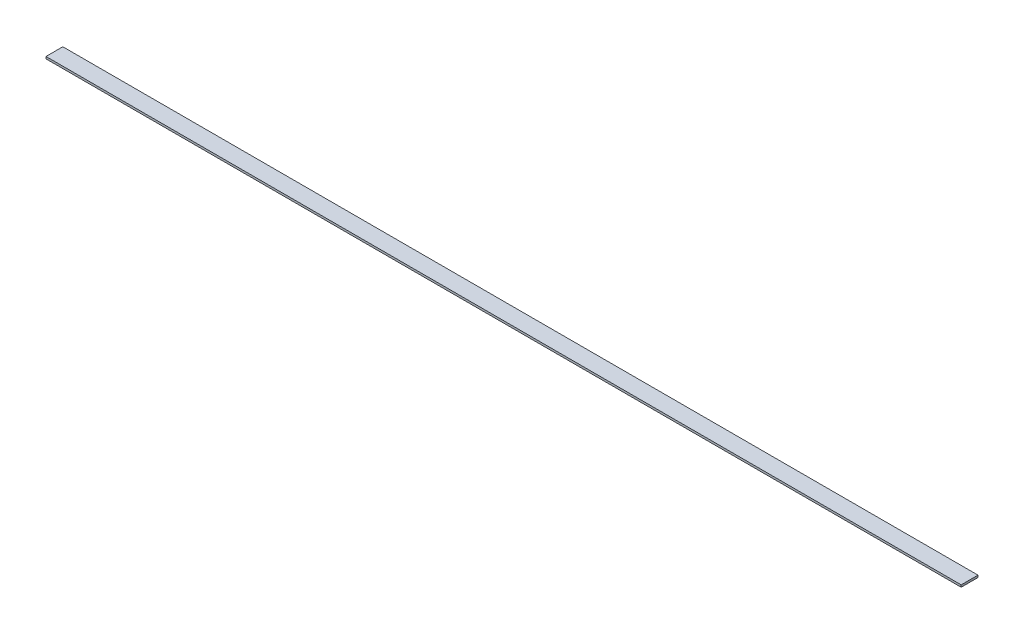
ISO-10303-21;
HEADER;
FILE_DESCRIPTION(('STEP AP214'),'2;1');
FILE_NAME('part.step','',(''),(''),'','','');
FILE_SCHEMA(('AUTOMOTIVE_DESIGN { 1 0 10303 214 1 1 1 1 }'));
ENDSEC;
DATA;
#1=APPLICATION_CONTEXT('core data for automotive mechanical design processes');
#2=APPLICATION_PROTOCOL_DEFINITION('international standard','automotive_design',2000,#1);
#3=PRODUCT_CONTEXT('',#1,'mechanical');
#4=PRODUCT('Part','Part','',(#3));
#5=PRODUCT_RELATED_PRODUCT_CATEGORY('part','',(#4));
#6=PRODUCT_DEFINITION_FORMATION('','',#4);
#7=PRODUCT_DEFINITION_CONTEXT('part definition',#1,'design');
#8=PRODUCT_DEFINITION('design','',#6,#7);
#9=PRODUCT_DEFINITION_SHAPE('','',#8);
#10=(LENGTH_UNIT() NAMED_UNIT(*) SI_UNIT(.MILLI.,.METRE.));
#11=(NAMED_UNIT(*) PLANE_ANGLE_UNIT() SI_UNIT($,.RADIAN.));
#12=(NAMED_UNIT(*) SI_UNIT($,.STERADIAN.) SOLID_ANGLE_UNIT());
#13=UNCERTAINTY_MEASURE_WITH_UNIT(LENGTH_MEASURE(1.E-05),#10,'distance_accuracy_value','');
#14=(GEOMETRIC_REPRESENTATION_CONTEXT(3) GLOBAL_UNCERTAINTY_ASSIGNED_CONTEXT((#13)) GLOBAL_UNIT_ASSIGNED_CONTEXT((#10,
#11,#12)) REPRESENTATION_CONTEXT('',''));
#15=CARTESIAN_POINT('',(0.,0.,0.));
#16=DIRECTION('',(0.,0.,1.));
#17=DIRECTION('',(1.,0.,0.));
#18=AXIS2_PLACEMENT_3D('',#15,#16,#17);
#19=CARTESIAN_POINT('',(544.,2.5,-10.));
#20=DIRECTION('',(-1.,0.,0.));
#21=DIRECTION('',(0.,0.,1.));
#22=AXIS2_PLACEMENT_3D('',#19,#20,#21);
#23=PLANE('',#22);
#24=DIRECTION('',(0.,0.,-1.));
#25=VECTOR('',#24,1.);
#26=CARTESIAN_POINT('',(544.,0.,-10.));
#27=LINE('',#26,#25);
#28=CARTESIAN_POINT('',(544.,0.,10.));
#29=VERTEX_POINT('',#28);
#30=CARTESIAN_POINT('',(544.,0.,-10.));
#31=VERTEX_POINT('',#30);
#32=EDGE_CURVE('E97',#29,#31,#27,.T.);
#33=ORIENTED_EDGE('',*,*,#32,.T.);
#34=DIRECTION('',(0.,-1.,0.));
#35=VECTOR('',#34,1.);
#36=CARTESIAN_POINT('',(544.,2.5,-10.));
#37=LINE('',#36,#35);
#38=CARTESIAN_POINT('',(544.,2.5,-10.));
#39=VERTEX_POINT('',#38);
#40=EDGE_CURVE('E11',#39,#31,#37,.T.);
#41=ORIENTED_EDGE('',*,*,#40,.F.);
#42=DIRECTION('',(0.,0.,-1.));
#43=VECTOR('',#42,1.);
#44=CARTESIAN_POINT('',(544.,2.5,-10.));
#45=LINE('',#44,#43);
#46=CARTESIAN_POINT('',(544.,2.5,10.));
#47=VERTEX_POINT('',#46);
#48=EDGE_CURVE('E85',#47,#39,#45,.T.);
#49=ORIENTED_EDGE('',*,*,#48,.F.);
#50=DIRECTION('',(0.,-1.,0.));
#51=VECTOR('',#50,1.);
#52=CARTESIAN_POINT('',(544.,2.5,10.));
#53=LINE('',#52,#51);
#54=EDGE_CURVE('E93',#47,#29,#53,.T.);
#55=ORIENTED_EDGE('',*,*,#54,.T.);
#56=EDGE_LOOP('',(#33,#41,#49,#55));
#57=FACE_BOUND('',#56,.T.);
#58=ADVANCED_FACE('F34',(#57),#23,.F.);
#59=CARTESIAN_POINT('',(-544.,2.5,-10.));
#60=DIRECTION('',(0.,0.,1.));
#61=DIRECTION('',(1.,0.,0.));
#62=AXIS2_PLACEMENT_3D('',#59,#60,#61);
#63=PLANE('',#62);
#64=DIRECTION('',(-1.,0.,0.));
#65=VECTOR('',#64,1.);
#66=CARTESIAN_POINT('',(-544.,0.,-10.));
#67=LINE('',#66,#65);
#68=CARTESIAN_POINT('',(-544.,0.,-10.));
#69=VERTEX_POINT('',#68);
#70=EDGE_CURVE('E89',#31,#69,#67,.T.);
#71=ORIENTED_EDGE('',*,*,#70,.T.);
#72=DIRECTION('',(0.,-1.,0.));
#73=VECTOR('',#72,1.);
#74=CARTESIAN_POINT('',(-544.,2.5,-10.));
#75=LINE('',#74,#73);
#76=CARTESIAN_POINT('',(-544.,2.5,-10.));
#77=VERTEX_POINT('',#76);
#78=EDGE_CURVE('E42',#77,#69,#75,.T.);
#79=ORIENTED_EDGE('',*,*,#78,.F.);
#80=DIRECTION('',(-1.,0.,0.));
#81=VECTOR('',#80,1.);
#82=CARTESIAN_POINT('',(-544.,2.5,-10.));
#83=LINE('',#82,#81);
#84=EDGE_CURVE('E80',#39,#77,#83,.T.);
#85=ORIENTED_EDGE('',*,*,#84,.F.);
#86=ORIENTED_EDGE('',*,*,#40,.T.);
#87=EDGE_LOOP('',(#71,#79,#85,#86));
#88=FACE_BOUND('',#87,.T.);
#89=ADVANCED_FACE('F88',(#88),#63,.F.);
#90=CARTESIAN_POINT('',(-544.,2.5,-10.));
#91=DIRECTION('',(1.,0.,0.));
#92=DIRECTION('',(0.,0.,-1.));
#93=AXIS2_PLACEMENT_3D('',#90,#91,#92);
#94=PLANE('',#93);
#95=DIRECTION('',(0.,0.,1.));
#96=VECTOR('',#95,1.);
#97=CARTESIAN_POINT('',(-544.,0.,-10.));
#98=LINE('',#97,#96);
#99=CARTESIAN_POINT('',(-544.,0.,10.));
#100=VERTEX_POINT('',#99);
#101=EDGE_CURVE('E67',#69,#100,#98,.T.);
#102=ORIENTED_EDGE('',*,*,#101,.T.);
#103=DIRECTION('',(0.,-1.,0.));
#104=VECTOR('',#103,1.);
#105=CARTESIAN_POINT('',(-544.,2.5,10.));
#106=LINE('',#105,#104);
#107=CARTESIAN_POINT('',(-544.,2.5,10.));
#108=VERTEX_POINT('',#107);
#109=EDGE_CURVE('E90',#108,#100,#106,.T.);
#110=ORIENTED_EDGE('',*,*,#109,.F.);
#111=DIRECTION('',(0.,0.,1.));
#112=VECTOR('',#111,1.);
#113=CARTESIAN_POINT('',(-544.,2.5,-10.));
#114=LINE('',#113,#112);
#115=EDGE_CURVE('E83',#77,#108,#114,.T.);
#116=ORIENTED_EDGE('',*,*,#115,.F.);
#117=ORIENTED_EDGE('',*,*,#78,.T.);
#118=EDGE_LOOP('',(#102,#110,#116,#117));
#119=FACE_BOUND('',#118,.T.);
#120=ADVANCED_FACE('F91',(#119),#94,.F.);
#121=CARTESIAN_POINT('',(-544.,2.5,10.));
#122=DIRECTION('',(0.,0.,-1.));
#123=DIRECTION('',(-1.,0.,0.));
#124=AXIS2_PLACEMENT_3D('',#121,#122,#123);
#125=PLANE('',#124);
#126=DIRECTION('',(1.,0.,0.));
#127=VECTOR('',#126,1.);
#128=CARTESIAN_POINT('',(-544.,0.,10.));
#129=LINE('',#128,#127);
#130=EDGE_CURVE('E73',#100,#29,#129,.T.);
#131=ORIENTED_EDGE('',*,*,#130,.T.);
#132=ORIENTED_EDGE('',*,*,#54,.F.);
#133=DIRECTION('',(1.,0.,0.));
#134=VECTOR('',#133,1.);
#135=CARTESIAN_POINT('',(-544.,2.5,10.));
#136=LINE('',#135,#134);
#137=EDGE_CURVE('E50',#108,#47,#136,.T.);
#138=ORIENTED_EDGE('',*,*,#137,.F.);
#139=ORIENTED_EDGE('',*,*,#109,.T.);
#140=EDGE_LOOP('',(#131,#132,#138,#139));
#141=FACE_BOUND('',#140,.T.);
#142=ADVANCED_FACE('F104',(#141),#125,.F.);
#143=CARTESIAN_POINT('',(0.,2.5,0.));
#144=DIRECTION('',(0.,1.,0.));
#145=DIRECTION('',(0.,0.,1.));
#146=AXIS2_PLACEMENT_3D('',#143,#144,#145);
#147=PLANE('',#146);
#148=ORIENTED_EDGE('',*,*,#48,.T.);
#149=ORIENTED_EDGE('',*,*,#84,.T.);
#150=ORIENTED_EDGE('',*,*,#115,.T.);
#151=ORIENTED_EDGE('',*,*,#137,.T.);
#152=EDGE_LOOP('',(#148,#149,#150,#151));
#153=FACE_BOUND('',#152,.T.);
#154=ADVANCED_FACE('F81',(#153),#147,.T.);
#155=CARTESIAN_POINT('',(0.,0.,0.));
#156=DIRECTION('',(0.,1.,0.));
#157=DIRECTION('',(0.,0.,1.));
#158=AXIS2_PLACEMENT_3D('',#155,#156,#157);
#159=PLANE('',#158);
#160=ORIENTED_EDGE('',*,*,#32,.F.);
#161=ORIENTED_EDGE('',*,*,#130,.F.);
#162=ORIENTED_EDGE('',*,*,#101,.F.);
#163=ORIENTED_EDGE('',*,*,#70,.F.);
#164=EDGE_LOOP('',(#160,#161,#162,#163));
#165=FACE_BOUND('',#164,.T.);
#166=ADVANCED_FACE('F107',(#165),#159,.F.);
#167=CLOSED_SHELL('',(#58,#89,#120,#142,#154,#166));
#168=MANIFOLD_SOLID_BREP('B2',#167);
#169=ADVANCED_BREP_SHAPE_REPRESENTATION('',(#18,#168),#14);
#170=SHAPE_DEFINITION_REPRESENTATION(#9,#169);
ENDSEC;
END-ISO-10303-21;
